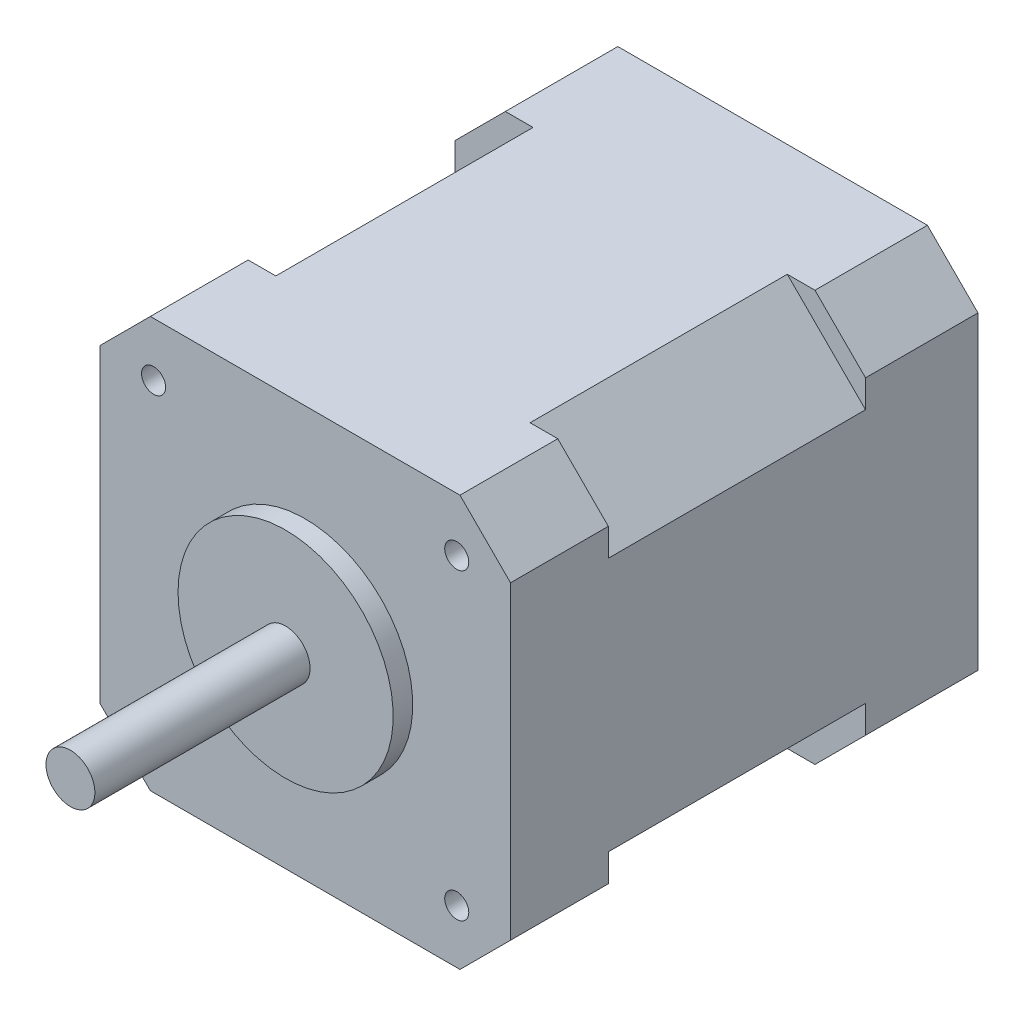
ISO-10303-21;
HEADER;
FILE_DESCRIPTION(('STEP AP214'),'2;1');
FILE_NAME('part.step','',(''),(''),'','','');
FILE_SCHEMA(('AUTOMOTIVE_DESIGN { 1 0 10303 214 1 1 1 1 }'));
ENDSEC;
DATA;
#1=APPLICATION_CONTEXT('core data for automotive mechanical design processes');
#2=APPLICATION_PROTOCOL_DEFINITION('international standard','automotive_design',2000,#1);
#3=PRODUCT_CONTEXT('',#1,'mechanical');
#4=PRODUCT('Part','Part','',(#3));
#5=PRODUCT_RELATED_PRODUCT_CATEGORY('part','',(#4));
#6=PRODUCT_DEFINITION_FORMATION('','',#4);
#7=PRODUCT_DEFINITION_CONTEXT('part definition',#1,'design');
#8=PRODUCT_DEFINITION('design','',#6,#7);
#9=PRODUCT_DEFINITION_SHAPE('','',#8);
#10=(LENGTH_UNIT() NAMED_UNIT(*) SI_UNIT(.MILLI.,.METRE.));
#11=(NAMED_UNIT(*) PLANE_ANGLE_UNIT() SI_UNIT($,.RADIAN.));
#12=(NAMED_UNIT(*) SI_UNIT($,.STERADIAN.) SOLID_ANGLE_UNIT());
#13=UNCERTAINTY_MEASURE_WITH_UNIT(LENGTH_MEASURE(1.E-05),#10,'distance_accuracy_value','');
#14=(GEOMETRIC_REPRESENTATION_CONTEXT(3) GLOBAL_UNCERTAINTY_ASSIGNED_CONTEXT((#13)) GLOBAL_UNIT_ASSIGNED_CONTEXT((#10,
#11,#12)) REPRESENTATION_CONTEXT('',''));
#15=CARTESIAN_POINT('',(0.,0.,0.));
#16=DIRECTION('',(0.,0.,1.));
#17=DIRECTION('',(1.,0.,0.));
#18=AXIS2_PLACEMENT_3D('',#15,#16,#17);
#19=CARTESIAN_POINT('',(21.,21.,11.5));
#20=DIRECTION('',(0.,0.,-1.));
#21=DIRECTION('',(-1.,0.,0.));
#22=AXIS2_PLACEMENT_3D('',#19,#20,#21);
#23=PLANE('',#22);
#24=DIRECTION('',(0.707106781186548,0.707106781186547,0.));
#25=VECTOR('',#24,1.);
#26=CARTESIAN_POINT('',(21.,-13.,11.5));
#27=LINE('',#26,#25);
#28=CARTESIAN_POINT('',(13.,-21.,11.5));
#29=VERTEX_POINT('',#28);
#30=CARTESIAN_POINT('',(21.,-13.,11.5));
#31=VERTEX_POINT('',#30);
#32=EDGE_CURVE('E217',#29,#31,#27,.T.);
#33=ORIENTED_EDGE('',*,*,#32,.F.);
#34=DIRECTION('',(-1.,0.,0.));
#35=VECTOR('',#34,1.);
#36=CARTESIAN_POINT('',(15.8284271247401,-21.,11.5));
#37=LINE('',#36,#35);
#38=CARTESIAN_POINT('',(15.8284271247401,-21.,11.5));
#39=VERTEX_POINT('',#38);
#40=EDGE_CURVE('E487',#39,#29,#37,.T.);
#41=ORIENTED_EDGE('',*,*,#40,.F.);
#42=DIRECTION('',(-0.707106781186547,-0.707106781186547,0.));
#43=VECTOR('',#42,1.);
#44=CARTESIAN_POINT('',(21.,-15.8284271247401,11.5));
#45=LINE('',#44,#43);
#46=CARTESIAN_POINT('',(21.,-15.8284271247401,11.5));
#47=VERTEX_POINT('',#46);
#48=EDGE_CURVE('E474',#47,#39,#45,.T.);
#49=ORIENTED_EDGE('',*,*,#48,.F.);
#50=DIRECTION('',(0.,-1.,0.));
#51=VECTOR('',#50,1.);
#52=CARTESIAN_POINT('',(21.,15.8284271247401,11.5));
#53=LINE('',#52,#51);
#54=EDGE_CURVE('E45',#31,#47,#53,.T.);
#55=ORIENTED_EDGE('',*,*,#54,.F.);
#56=EDGE_LOOP('',(#33,#41,#49,#55));
#57=FACE_BOUND('',#56,.T.);
#58=ADVANCED_FACE('F30',(#57),#23,.F.);
#59=DIRECTION('',(0.707106781186547,-0.707106781186548,0.));
#60=VECTOR('',#59,1.);
#61=CARTESIAN_POINT('',(-13.,-21.,11.5));
#62=LINE('',#61,#60);
#63=CARTESIAN_POINT('',(-21.,-13.,11.5));
#64=VERTEX_POINT('',#63);
#65=CARTESIAN_POINT('',(-13.,-21.,11.5));
#66=VERTEX_POINT('',#65);
#67=EDGE_CURVE('E341',#64,#66,#62,.T.);
#68=ORIENTED_EDGE('',*,*,#67,.F.);
#69=DIRECTION('',(0.,1.,0.));
#70=VECTOR('',#69,1.);
#71=CARTESIAN_POINT('',(-21.,-15.8284271247401,11.5));
#72=LINE('',#71,#70);
#73=CARTESIAN_POINT('',(-21.,-15.8284271247401,11.5));
#74=VERTEX_POINT('',#73);
#75=EDGE_CURVE('E401',#74,#64,#72,.T.);
#76=ORIENTED_EDGE('',*,*,#75,.F.);
#77=DIRECTION('',(-0.707106781186547,0.707106781186548,0.));
#78=VECTOR('',#77,1.);
#79=CARTESIAN_POINT('',(-15.8284271247401,-21.,11.5));
#80=LINE('',#79,#78);
#81=CARTESIAN_POINT('',(-15.8284271247401,-21.,11.5));
#82=VERTEX_POINT('',#81);
#83=EDGE_CURVE('E412',#82,#74,#80,.T.);
#84=ORIENTED_EDGE('',*,*,#83,.F.);
#85=EDGE_CURVE('E477',#66,#82,#37,.T.);
#86=ORIENTED_EDGE('',*,*,#85,.F.);
#87=EDGE_LOOP('',(#68,#76,#84,#86));
#88=FACE_BOUND('',#87,.T.);
#89=ADVANCED_FACE('F494',(#88),#23,.F.);
#90=DIRECTION('',(-0.707106781186548,-0.707106781186548,0.));
#91=VECTOR('',#90,1.);
#92=CARTESIAN_POINT('',(-21.,13.,11.5));
#93=LINE('',#92,#91);
#94=CARTESIAN_POINT('',(-13.,21.,11.5));
#95=VERTEX_POINT('',#94);
#96=CARTESIAN_POINT('',(-21.,13.,11.5));
#97=VERTEX_POINT('',#96);
#98=EDGE_CURVE('E346',#95,#97,#93,.T.);
#99=ORIENTED_EDGE('',*,*,#98,.F.);
#100=DIRECTION('',(1.,0.,0.));
#101=VECTOR('',#100,1.);
#102=CARTESIAN_POINT('',(-15.8284271247401,21.,11.5));
#103=LINE('',#102,#101);
#104=CARTESIAN_POINT('',(-15.8284271247401,21.,11.5));
#105=VERTEX_POINT('',#104);
#106=EDGE_CURVE('E462',#105,#95,#103,.T.);
#107=ORIENTED_EDGE('',*,*,#106,.F.);
#108=DIRECTION('',(0.707106781186547,0.707106781186548,0.));
#109=VECTOR('',#108,1.);
#110=CARTESIAN_POINT('',(-21.,15.8284271247401,11.5));
#111=LINE('',#110,#109);
#112=CARTESIAN_POINT('',(-21.,15.8284271247401,11.5));
#113=VERTEX_POINT('',#112);
#114=EDGE_CURVE('E406',#113,#105,#111,.T.);
#115=ORIENTED_EDGE('',*,*,#114,.F.);
#116=EDGE_CURVE('E407',#97,#113,#72,.T.);
#117=ORIENTED_EDGE('',*,*,#116,.F.);
#118=EDGE_LOOP('',(#99,#107,#115,#117));
#119=FACE_BOUND('',#118,.T.);
#120=ADVANCED_FACE('F496',(#119),#23,.F.);
#121=DIRECTION('',(-0.707106781186548,0.707106781186547,0.));
#122=VECTOR('',#121,1.);
#123=CARTESIAN_POINT('',(13.,21.,11.5));
#124=LINE('',#123,#122);
#125=CARTESIAN_POINT('',(21.,13.,11.5));
#126=VERTEX_POINT('',#125);
#127=CARTESIAN_POINT('',(13.,21.,11.5));
#128=VERTEX_POINT('',#127);
#129=EDGE_CURVE('E53',#126,#128,#124,.T.);
#130=ORIENTED_EDGE('',*,*,#129,.F.);
#131=CARTESIAN_POINT('',(21.,15.8284271247401,11.5));
#132=VERTEX_POINT('',#131);
#133=EDGE_CURVE('E473',#132,#126,#53,.T.);
#134=ORIENTED_EDGE('',*,*,#133,.F.);
#135=DIRECTION('',(0.707106781186547,-0.707106781186548,0.));
#136=VECTOR('',#135,1.);
#137=CARTESIAN_POINT('',(15.8284271247401,21.,11.5));
#138=LINE('',#137,#136);
#139=CARTESIAN_POINT('',(15.8284271247401,21.,11.5));
#140=VERTEX_POINT('',#139);
#141=EDGE_CURVE('E464',#140,#132,#138,.T.);
#142=ORIENTED_EDGE('',*,*,#141,.F.);
#143=EDGE_CURVE('E416',#128,#140,#103,.T.);
#144=ORIENTED_EDGE('',*,*,#143,.F.);
#145=EDGE_LOOP('',(#130,#134,#142,#144));
#146=FACE_BOUND('',#145,.T.);
#147=ADVANCED_FACE('F472',(#146),#23,.F.);
#148=CARTESIAN_POINT('',(-15.8284271247401,21.,11.5));
#149=DIRECTION('',(0.,1.,0.));
#150=DIRECTION('',(0.,0.,1.));
#151=AXIS2_PLACEMENT_3D('',#148,#149,#150);
#152=PLANE('',#151);
#153=DIRECTION('',(1.,0.,0.));
#154=VECTOR('',#153,1.);
#155=CARTESIAN_POINT('',(-15.8284271247401,21.,0.));
#156=LINE('',#155,#154);
#157=CARTESIAN_POINT('',(-15.8284271247401,21.,0.));
#158=VERTEX_POINT('',#157);
#159=CARTESIAN_POINT('',(15.8284271247401,21.,0.));
#160=VERTEX_POINT('',#159);
#161=EDGE_CURVE('E424',#158,#160,#156,.T.);
#162=ORIENTED_EDGE('',*,*,#161,.F.);
#163=DIRECTION('',(0.,0.,-1.));
#164=VECTOR('',#163,1.);
#165=CARTESIAN_POINT('',(-15.8284271247401,21.,11.5));
#166=LINE('',#165,#164);
#167=EDGE_CURVE('E449',#105,#158,#166,.T.);
#168=ORIENTED_EDGE('',*,*,#167,.F.);
#169=ORIENTED_EDGE('',*,*,#106,.T.);
#170=DIRECTION('',(0.,0.,-1.));
#171=VECTOR('',#170,1.);
#172=CARTESIAN_POINT('',(-13.,21.,37.8));
#173=LINE('',#172,#171);
#174=CARTESIAN_POINT('',(-13.,21.,37.8));
#175=VERTEX_POINT('',#174);
#176=EDGE_CURVE('E366',#175,#95,#173,.T.);
#177=ORIENTED_EDGE('',*,*,#176,.F.);
#178=DIRECTION('',(-1.,0.,0.));
#179=VECTOR('',#178,1.);
#180=CARTESIAN_POINT('',(-15.8284271247401,21.,37.8));
#181=LINE('',#180,#179);
#182=CARTESIAN_POINT('',(-15.8284271247401,21.,37.8));
#183=VERTEX_POINT('',#182);
#184=EDGE_CURVE('E215',#175,#183,#181,.T.);
#185=ORIENTED_EDGE('',*,*,#184,.T.);
#186=DIRECTION('',(0.,0.,-1.));
#187=VECTOR('',#186,1.);
#188=CARTESIAN_POINT('',(-15.8284271247401,21.,47.8));
#189=LINE('',#188,#187);
#190=CARTESIAN_POINT('',(-15.8284271247401,21.,47.8));
#191=VERTEX_POINT('',#190);
#192=EDGE_CURVE('E196',#191,#183,#189,.T.);
#193=ORIENTED_EDGE('',*,*,#192,.F.);
#194=DIRECTION('',(-1.,0.,0.));
#195=VECTOR('',#194,1.);
#196=CARTESIAN_POINT('',(-15.8284271247401,21.,47.8));
#197=LINE('',#196,#195);
#198=CARTESIAN_POINT('',(15.8284271247401,21.,47.8));
#199=VERTEX_POINT('',#198);
#200=EDGE_CURVE('E202',#199,#191,#197,.T.);
#201=ORIENTED_EDGE('',*,*,#200,.F.);
#202=DIRECTION('',(0.,0.,-1.));
#203=VECTOR('',#202,1.);
#204=CARTESIAN_POINT('',(15.8284271247401,21.,47.8));
#205=LINE('',#204,#203);
#206=CARTESIAN_POINT('',(15.8284271247401,21.,37.8));
#207=VERTEX_POINT('',#206);
#208=EDGE_CURVE('E284',#199,#207,#205,.T.);
#209=ORIENTED_EDGE('',*,*,#208,.T.);
#210=CARTESIAN_POINT('',(13.,21.,37.8));
#211=VERTEX_POINT('',#210);
#212=EDGE_CURVE('E225',#207,#211,#181,.T.);
#213=ORIENTED_EDGE('',*,*,#212,.T.);
#214=DIRECTION('',(0.,0.,-1.));
#215=VECTOR('',#214,1.);
#216=CARTESIAN_POINT('',(13.,21.,37.8));
#217=LINE('',#216,#215);
#218=EDGE_CURVE('E290',#211,#128,#217,.T.);
#219=ORIENTED_EDGE('',*,*,#218,.T.);
#220=ORIENTED_EDGE('',*,*,#143,.T.);
#221=DIRECTION('',(0.,0.,-1.));
#222=VECTOR('',#221,1.);
#223=CARTESIAN_POINT('',(15.8284271247401,21.,11.5));
#224=LINE('',#223,#222);
#225=EDGE_CURVE('E410',#140,#160,#224,.T.);
#226=ORIENTED_EDGE('',*,*,#225,.T.);
#227=EDGE_LOOP('',(#162,#168,#169,#177,#185,#193,#201,#209,#213,#219,#220,#226));
#228=FACE_BOUND('',#227,.T.);
#229=ADVANCED_FACE('F32',(#228),#152,.T.);
#230=CARTESIAN_POINT('',(-21.,15.8284271247401,11.5));
#231=DIRECTION('',(-0.707106781186548,0.707106781186547,0.));
#232=DIRECTION('',(-0.707106781186547,-0.707106781186548,0.));
#233=AXIS2_PLACEMENT_3D('',#230,#231,#232);
#234=PLANE('',#233);
#235=DIRECTION('',(0.707106781186547,0.707106781186548,0.));
#236=VECTOR('',#235,1.);
#237=CARTESIAN_POINT('',(-21.,15.8284271247401,0.));
#238=LINE('',#237,#236);
#239=CARTESIAN_POINT('',(-21.,15.8284271247401,0.));
#240=VERTEX_POINT('',#239);
#241=EDGE_CURVE('E446',#240,#158,#238,.T.);
#242=ORIENTED_EDGE('',*,*,#241,.F.);
#243=DIRECTION('',(0.,0.,-1.));
#244=VECTOR('',#243,1.);
#245=CARTESIAN_POINT('',(-21.,15.8284271247401,11.5));
#246=LINE('',#245,#244);
#247=EDGE_CURVE('E451',#113,#240,#246,.T.);
#248=ORIENTED_EDGE('',*,*,#247,.F.);
#249=ORIENTED_EDGE('',*,*,#114,.T.);
#250=ORIENTED_EDGE('',*,*,#167,.T.);
#251=EDGE_LOOP('',(#242,#248,#249,#250));
#252=FACE_BOUND('',#251,.T.);
#253=ADVANCED_FACE('F511',(#252),#234,.T.);
#254=CARTESIAN_POINT('',(-21.,-15.8284271247401,11.5));
#255=DIRECTION('',(-1.,0.,0.));
#256=DIRECTION('',(0.,-1.,0.));
#257=AXIS2_PLACEMENT_3D('',#254,#255,#256);
#258=PLANE('',#257);
#259=CARTESIAN_POINT('',(-21.,0.649999999999998,4.95));
#260=DIRECTION('',(-1.,0.,0.));
#261=DIRECTION('',(0.,-1.,0.));
#262=AXIS2_PLACEMENT_3D('',#259,#260,#261);
#263=CIRCLE('',#262,0.6);
#264=CARTESIAN_POINT('',(-21.,0.049999999999998,4.95));
#265=VERTEX_POINT('',#264);
#266=EDGE_CURVE('E11',#265,#265,#263,.T.);
#267=ORIENTED_EDGE('',*,*,#266,.F.);
#268=EDGE_LOOP('',(#267));
#269=FACE_BOUND('',#268,.T.);
#270=CARTESIAN_POINT('',(-21.,-0.650000000000001,4.95));
#271=DIRECTION('',(-1.,0.,0.));
#272=DIRECTION('',(0.,-1.,0.));
#273=AXIS2_PLACEMENT_3D('',#270,#271,#272);
#274=CIRCLE('',#273,0.6);
#275=CARTESIAN_POINT('',(-21.,-1.25,4.95));
#276=VERTEX_POINT('',#275);
#277=EDGE_CURVE('E38',#276,#276,#274,.T.);
#278=ORIENTED_EDGE('',*,*,#277,.F.);
#279=EDGE_LOOP('',(#278));
#280=FACE_BOUND('',#279,.T.);
#281=CARTESIAN_POINT('',(-21.,-0.650000000000001,3.65));
#282=DIRECTION('',(-1.,0.,0.));
#283=DIRECTION('',(0.,-1.,0.));
#284=AXIS2_PLACEMENT_3D('',#281,#282,#283);
#285=CIRCLE('',#284,0.6);
#286=CARTESIAN_POINT('',(-21.,-1.25,3.65));
#287=VERTEX_POINT('',#286);
#288=EDGE_CURVE('E1010',#287,#287,#285,.T.);
#289=ORIENTED_EDGE('',*,*,#288,.F.);
#290=EDGE_LOOP('',(#289));
#291=FACE_BOUND('',#290,.T.);
#292=CARTESIAN_POINT('',(-21.,0.649999999999998,3.65));
#293=DIRECTION('',(-1.,0.,0.));
#294=DIRECTION('',(0.,-1.,0.));
#295=AXIS2_PLACEMENT_3D('',#292,#293,#294);
#296=CIRCLE('',#295,0.6);
#297=CARTESIAN_POINT('',(-21.,0.049999999999998,3.65));
#298=VERTEX_POINT('',#297);
#299=EDGE_CURVE('E351',#298,#298,#296,.T.);
#300=ORIENTED_EDGE('',*,*,#299,.F.);
#301=EDGE_LOOP('',(#300));
#302=FACE_BOUND('',#301,.T.);
#303=DIRECTION('',(0.,1.,0.));
#304=VECTOR('',#303,1.);
#305=CARTESIAN_POINT('',(-21.,-15.8284271247401,0.));
#306=LINE('',#305,#304);
#307=CARTESIAN_POINT('',(-21.,-15.8284271247401,0.));
#308=VERTEX_POINT('',#307);
#309=EDGE_CURVE('E443',#308,#240,#306,.T.);
#310=ORIENTED_EDGE('',*,*,#309,.F.);
#311=DIRECTION('',(0.,0.,-1.));
#312=VECTOR('',#311,1.);
#313=CARTESIAN_POINT('',(-21.,-15.8284271247401,11.5));
#314=LINE('',#313,#312);
#315=EDGE_CURVE('E402',#74,#308,#314,.T.);
#316=ORIENTED_EDGE('',*,*,#315,.F.);
#317=ORIENTED_EDGE('',*,*,#75,.T.);
#318=DIRECTION('',(0.,0.,-1.));
#319=VECTOR('',#318,1.);
#320=CARTESIAN_POINT('',(-21.,-13.,37.8));
#321=LINE('',#320,#319);
#322=CARTESIAN_POINT('',(-21.,-13.,37.8));
#323=VERTEX_POINT('',#322);
#324=EDGE_CURVE('E374',#323,#64,#321,.T.);
#325=ORIENTED_EDGE('',*,*,#324,.F.);
#326=DIRECTION('',(0.,-1.,0.));
#327=VECTOR('',#326,1.);
#328=CARTESIAN_POINT('',(-21.,-15.8284271247401,37.8));
#329=LINE('',#328,#327);
#330=CARTESIAN_POINT('',(-21.,-15.8284271247401,37.8));
#331=VERTEX_POINT('',#330);
#332=EDGE_CURVE('E237',#323,#331,#329,.T.);
#333=ORIENTED_EDGE('',*,*,#332,.T.);
#334=DIRECTION('',(0.,0.,-1.));
#335=VECTOR('',#334,1.);
#336=CARTESIAN_POINT('',(-21.,-15.8284271247401,47.8));
#337=LINE('',#336,#335);
#338=CARTESIAN_POINT('',(-21.,-15.8284271247401,47.8));
#339=VERTEX_POINT('',#338);
#340=EDGE_CURVE('E221',#339,#331,#337,.T.);
#341=ORIENTED_EDGE('',*,*,#340,.F.);
#342=DIRECTION('',(0.,-1.,0.));
#343=VECTOR('',#342,1.);
#344=CARTESIAN_POINT('',(-21.,-15.8284271247401,47.8));
#345=LINE('',#344,#343);
#346=CARTESIAN_POINT('',(-21.,15.8284271247401,47.8));
#347=VERTEX_POINT('',#346);
#348=EDGE_CURVE('E201',#347,#339,#345,.T.);
#349=ORIENTED_EDGE('',*,*,#348,.F.);
#350=DIRECTION('',(0.,0.,-1.));
#351=VECTOR('',#350,1.);
#352=CARTESIAN_POINT('',(-21.,15.8284271247401,47.8));
#353=LINE('',#352,#351);
#354=CARTESIAN_POINT('',(-21.,15.8284271247401,37.8));
#355=VERTEX_POINT('',#354);
#356=EDGE_CURVE('E198',#347,#355,#353,.T.);
#357=ORIENTED_EDGE('',*,*,#356,.T.);
#358=CARTESIAN_POINT('',(-21.,13.,37.8));
#359=VERTEX_POINT('',#358);
#360=EDGE_CURVE('E246',#355,#359,#329,.T.);
#361=ORIENTED_EDGE('',*,*,#360,.T.);
#362=DIRECTION('',(0.,0.,-1.));
#363=VECTOR('',#362,1.);
#364=CARTESIAN_POINT('',(-21.,13.,37.8));
#365=LINE('',#364,#363);
#366=EDGE_CURVE('E369',#359,#97,#365,.T.);
#367=ORIENTED_EDGE('',*,*,#366,.T.);
#368=ORIENTED_EDGE('',*,*,#116,.T.);
#369=ORIENTED_EDGE('',*,*,#247,.T.);
#370=EDGE_LOOP('',(#310,#316,#317,#325,#333,#341,#349,#357,#361,#367,#368,#369));
#371=FACE_BOUND('',#370,.T.);
#372=ADVANCED_FACE('F399',(#269,#280,#291,#302,#371),#258,.T.);
#373=CARTESIAN_POINT('',(-15.8284271247401,-21.,11.5));
#374=DIRECTION('',(-0.707106781186548,-0.707106781186547,0.));
#375=DIRECTION('',(0.707106781186547,-0.707106781186548,0.));
#376=AXIS2_PLACEMENT_3D('',#373,#374,#375);
#377=PLANE('',#376);
#378=DIRECTION('',(-0.707106781186547,0.707106781186548,0.));
#379=VECTOR('',#378,1.);
#380=CARTESIAN_POINT('',(-15.8284271247401,-21.,0.));
#381=LINE('',#380,#379);
#382=CARTESIAN_POINT('',(-15.8284271247401,-21.,0.));
#383=VERTEX_POINT('',#382);
#384=EDGE_CURVE('E440',#383,#308,#381,.T.);
#385=ORIENTED_EDGE('',*,*,#384,.F.);
#386=DIRECTION('',(0.,0.,-1.));
#387=VECTOR('',#386,1.);
#388=CARTESIAN_POINT('',(-15.8284271247401,-21.,11.5));
#389=LINE('',#388,#387);
#390=EDGE_CURVE('E454',#82,#383,#389,.T.);
#391=ORIENTED_EDGE('',*,*,#390,.F.);
#392=ORIENTED_EDGE('',*,*,#83,.T.);
#393=ORIENTED_EDGE('',*,*,#315,.T.);
#394=EDGE_LOOP('',(#385,#391,#392,#393));
#395=FACE_BOUND('',#394,.T.);
#396=ADVANCED_FACE('F493',(#395),#377,.T.);
#397=CARTESIAN_POINT('',(15.8284271247401,-21.,11.5));
#398=DIRECTION('',(0.,-1.,0.));
#399=DIRECTION('',(1.,0.,0.));
#400=AXIS2_PLACEMENT_3D('',#397,#398,#399);
#401=PLANE('',#400);
#402=DIRECTION('',(-1.,0.,0.));
#403=VECTOR('',#402,1.);
#404=CARTESIAN_POINT('',(15.8284271247401,-21.,0.));
#405=LINE('',#404,#403);
#406=CARTESIAN_POINT('',(15.8284271247401,-21.,0.));
#407=VERTEX_POINT('',#406);
#408=EDGE_CURVE('E437',#407,#383,#405,.T.);
#409=ORIENTED_EDGE('',*,*,#408,.F.);
#410=DIRECTION('',(0.,0.,-1.));
#411=VECTOR('',#410,1.);
#412=CARTESIAN_POINT('',(15.8284271247401,-21.,11.5));
#413=LINE('',#412,#411);
#414=EDGE_CURVE('E456',#39,#407,#413,.T.);
#415=ORIENTED_EDGE('',*,*,#414,.F.);
#416=ORIENTED_EDGE('',*,*,#40,.T.);
#417=DIRECTION('',(0.,0.,-1.));
#418=VECTOR('',#417,1.);
#419=CARTESIAN_POINT('',(13.,-21.,37.8));
#420=LINE('',#419,#418);
#421=CARTESIAN_POINT('',(13.,-21.,37.8));
#422=VERTEX_POINT('',#421);
#423=EDGE_CURVE('E363',#422,#29,#420,.T.);
#424=ORIENTED_EDGE('',*,*,#423,.F.);
#425=DIRECTION('',(1.,0.,0.));
#426=VECTOR('',#425,1.);
#427=CARTESIAN_POINT('',(15.8284271247401,-21.,37.8));
#428=LINE('',#427,#426);
#429=CARTESIAN_POINT('',(15.8284271247401,-21.,37.8));
#430=VERTEX_POINT('',#429);
#431=EDGE_CURVE('E249',#422,#430,#428,.T.);
#432=ORIENTED_EDGE('',*,*,#431,.T.);
#433=DIRECTION('',(0.,0.,-1.));
#434=VECTOR('',#433,1.);
#435=CARTESIAN_POINT('',(15.8284271247401,-21.,47.8));
#436=LINE('',#435,#434);
#437=CARTESIAN_POINT('',(15.8284271247401,-21.,47.8));
#438=VERTEX_POINT('',#437);
#439=EDGE_CURVE('E294',#438,#430,#436,.T.);
#440=ORIENTED_EDGE('',*,*,#439,.F.);
#441=DIRECTION('',(1.,0.,0.));
#442=VECTOR('',#441,1.);
#443=CARTESIAN_POINT('',(15.8284271247401,-21.,47.8));
#444=LINE('',#443,#442);
#445=CARTESIAN_POINT('',(-15.8284271247401,-21.,47.8));
#446=VERTEX_POINT('',#445);
#447=EDGE_CURVE('E323',#446,#438,#444,.T.);
#448=ORIENTED_EDGE('',*,*,#447,.F.);
#449=DIRECTION('',(0.,0.,-1.));
#450=VECTOR('',#449,1.);
#451=CARTESIAN_POINT('',(-15.8284271247401,-21.,47.8));
#452=LINE('',#451,#450);
#453=CARTESIAN_POINT('',(-15.8284271247401,-21.,37.8));
#454=VERTEX_POINT('',#453);
#455=EDGE_CURVE('E297',#446,#454,#452,.T.);
#456=ORIENTED_EDGE('',*,*,#455,.T.);
#457=CARTESIAN_POINT('',(-13.,-21.,37.8));
#458=VERTEX_POINT('',#457);
#459=EDGE_CURVE('E251',#454,#458,#428,.T.);
#460=ORIENTED_EDGE('',*,*,#459,.T.);
#461=DIRECTION('',(0.,0.,-1.));
#462=VECTOR('',#461,1.);
#463=CARTESIAN_POINT('',(-13.,-21.,37.8));
#464=LINE('',#463,#462);
#465=EDGE_CURVE('E320',#458,#66,#464,.T.);
#466=ORIENTED_EDGE('',*,*,#465,.T.);
#467=ORIENTED_EDGE('',*,*,#85,.T.);
#468=ORIENTED_EDGE('',*,*,#390,.T.);
#469=EDGE_LOOP('',(#409,#415,#416,#424,#432,#440,#448,#456,#460,#466,#467,#468));
#470=FACE_BOUND('',#469,.T.);
#471=ADVANCED_FACE('F319',(#470),#401,.T.);
#472=CARTESIAN_POINT('',(21.,-15.8284271247401,11.5));
#473=DIRECTION('',(0.707106781186548,-0.707106781186548,0.));
#474=DIRECTION('',(0.707106781186548,0.707106781186548,0.));
#475=AXIS2_PLACEMENT_3D('',#472,#473,#474);
#476=PLANE('',#475);
#477=DIRECTION('',(-0.707106781186547,-0.707106781186547,0.));
#478=VECTOR('',#477,1.);
#479=CARTESIAN_POINT('',(21.,-15.8284271247401,0.));
#480=LINE('',#479,#478);
#481=CARTESIAN_POINT('',(21.,-15.8284271247401,0.));
#482=VERTEX_POINT('',#481);
#483=EDGE_CURVE('E434',#482,#407,#480,.T.);
#484=ORIENTED_EDGE('',*,*,#483,.F.);
#485=DIRECTION('',(0.,0.,-1.));
#486=VECTOR('',#485,1.);
#487=CARTESIAN_POINT('',(21.,-15.8284271247401,11.5));
#488=LINE('',#487,#486);
#489=EDGE_CURVE('E458',#47,#482,#488,.T.);
#490=ORIENTED_EDGE('',*,*,#489,.F.);
#491=ORIENTED_EDGE('',*,*,#48,.T.);
#492=ORIENTED_EDGE('',*,*,#414,.T.);
#493=EDGE_LOOP('',(#484,#490,#491,#492));
#494=FACE_BOUND('',#493,.T.);
#495=ADVANCED_FACE('F522',(#494),#476,.T.);
#496=CARTESIAN_POINT('',(21.,15.8284271247401,11.5));
#497=DIRECTION('',(1.,0.,0.));
#498=DIRECTION('',(0.,0.,-1.));
#499=AXIS2_PLACEMENT_3D('',#496,#497,#498);
#500=PLANE('',#499);
#501=DIRECTION('',(0.,-1.,0.));
#502=VECTOR('',#501,1.);
#503=CARTESIAN_POINT('',(21.,15.8284271247401,0.));
#504=LINE('',#503,#502);
#505=CARTESIAN_POINT('',(21.,15.8284271247401,0.));
#506=VERTEX_POINT('',#505);
#507=EDGE_CURVE('E431',#506,#482,#504,.T.);
#508=ORIENTED_EDGE('',*,*,#507,.F.);
#509=DIRECTION('',(0.,0.,-1.));
#510=VECTOR('',#509,1.);
#511=CARTESIAN_POINT('',(21.,15.8284271247401,11.5));
#512=LINE('',#511,#510);
#513=EDGE_CURVE('E460',#132,#506,#512,.T.);
#514=ORIENTED_EDGE('',*,*,#513,.F.);
#515=ORIENTED_EDGE('',*,*,#133,.T.);
#516=DIRECTION('',(0.,0.,-1.));
#517=VECTOR('',#516,1.);
#518=CARTESIAN_POINT('',(21.,13.,37.8));
#519=LINE('',#518,#517);
#520=CARTESIAN_POINT('',(21.,13.,37.8));
#521=VERTEX_POINT('',#520);
#522=EDGE_CURVE('E276',#521,#126,#519,.T.);
#523=ORIENTED_EDGE('',*,*,#522,.F.);
#524=DIRECTION('',(0.,1.,0.));
#525=VECTOR('',#524,1.);
#526=CARTESIAN_POINT('',(21.,15.8284271247401,37.8));
#527=LINE('',#526,#525);
#528=CARTESIAN_POINT('',(21.,15.8284271247401,37.8));
#529=VERTEX_POINT('',#528);
#530=EDGE_CURVE('E258',#521,#529,#527,.T.);
#531=ORIENTED_EDGE('',*,*,#530,.T.);
#532=DIRECTION('',(0.,0.,-1.));
#533=VECTOR('',#532,1.);
#534=CARTESIAN_POINT('',(21.,15.8284271247401,47.8));
#535=LINE('',#534,#533);
#536=CARTESIAN_POINT('',(21.,15.8284271247401,47.8));
#537=VERTEX_POINT('',#536);
#538=EDGE_CURVE('E274',#537,#529,#535,.T.);
#539=ORIENTED_EDGE('',*,*,#538,.F.);
#540=DIRECTION('',(0.,1.,0.));
#541=VECTOR('',#540,1.);
#542=CARTESIAN_POINT('',(21.,15.8284271247401,47.8));
#543=LINE('',#542,#541);
#544=CARTESIAN_POINT('',(21.,-15.8284271247401,47.8));
#545=VERTEX_POINT('',#544);
#546=EDGE_CURVE('E291',#545,#537,#543,.T.);
#547=ORIENTED_EDGE('',*,*,#546,.F.);
#548=DIRECTION('',(0.,0.,-1.));
#549=VECTOR('',#548,1.);
#550=CARTESIAN_POINT('',(21.,-15.8284271247401,47.8));
#551=LINE('',#550,#549);
#552=CARTESIAN_POINT('',(21.,-15.8284271247401,37.8));
#553=VERTEX_POINT('',#552);
#554=EDGE_CURVE('E283',#545,#553,#551,.T.);
#555=ORIENTED_EDGE('',*,*,#554,.T.);
#556=CARTESIAN_POINT('',(21.,-13.,37.8));
#557=VERTEX_POINT('',#556);
#558=EDGE_CURVE('E263',#553,#557,#527,.T.);
#559=ORIENTED_EDGE('',*,*,#558,.T.);
#560=DIRECTION('',(0.,0.,-1.));
#561=VECTOR('',#560,1.);
#562=CARTESIAN_POINT('',(21.,-13.,37.8));
#563=LINE('',#562,#561);
#564=EDGE_CURVE('E428',#557,#31,#563,.T.);
#565=ORIENTED_EDGE('',*,*,#564,.T.);
#566=ORIENTED_EDGE('',*,*,#54,.T.);
#567=ORIENTED_EDGE('',*,*,#489,.T.);
#568=EDGE_LOOP('',(#508,#514,#515,#523,#531,#539,#547,#555,#559,#565,#566,#567));
#569=FACE_BOUND('',#568,.T.);
#570=ADVANCED_FACE('F272',(#569),#500,.T.);
#571=CARTESIAN_POINT('',(15.8284271247401,21.,11.5));
#572=DIRECTION('',(0.707106781186548,0.707106781186547,0.));
#573=DIRECTION('',(-0.707106781186547,0.707106781186548,0.));
#574=AXIS2_PLACEMENT_3D('',#571,#572,#573);
#575=PLANE('',#574);
#576=DIRECTION('',(0.707106781186547,-0.707106781186548,0.));
#577=VECTOR('',#576,1.);
#578=CARTESIAN_POINT('',(15.8284271247401,21.,0.));
#579=LINE('',#578,#577);
#580=EDGE_CURVE('E427',#160,#506,#579,.T.);
#581=ORIENTED_EDGE('',*,*,#580,.F.);
#582=ORIENTED_EDGE('',*,*,#225,.F.);
#583=ORIENTED_EDGE('',*,*,#141,.T.);
#584=ORIENTED_EDGE('',*,*,#513,.T.);
#585=EDGE_LOOP('',(#581,#582,#583,#584));
#586=FACE_BOUND('',#585,.T.);
#587=ADVANCED_FACE('F471',(#586),#575,.T.);
#588=CARTESIAN_POINT('',(21.,21.,0.));
#589=DIRECTION('',(0.,0.,-1.));
#590=DIRECTION('',(-1.,0.,0.));
#591=AXIS2_PLACEMENT_3D('',#588,#589,#590);
#592=PLANE('',#591);
#593=ORIENTED_EDGE('',*,*,#161,.T.);
#594=ORIENTED_EDGE('',*,*,#580,.T.);
#595=ORIENTED_EDGE('',*,*,#507,.T.);
#596=ORIENTED_EDGE('',*,*,#483,.T.);
#597=ORIENTED_EDGE('',*,*,#408,.T.);
#598=ORIENTED_EDGE('',*,*,#384,.T.);
#599=ORIENTED_EDGE('',*,*,#309,.T.);
#600=ORIENTED_EDGE('',*,*,#241,.T.);
#601=EDGE_LOOP('',(#593,#594,#595,#596,#597,#598,#599,#600));
#602=FACE_BOUND('',#601,.T.);
#603=ADVANCED_FACE('F507',(#602),#592,.T.);
#604=CARTESIAN_POINT('',(21.,-13.,37.8));
#605=DIRECTION('',(-0.707106781186547,0.707106781186548,0.));
#606=DIRECTION('',(-0.707106781186548,-0.707106781186547,0.));
#607=AXIS2_PLACEMENT_3D('',#604,#605,#606);
#608=PLANE('',#607);
#609=ORIENTED_EDGE('',*,*,#32,.T.);
#610=ORIENTED_EDGE('',*,*,#564,.F.);
#611=DIRECTION('',(0.707106781186548,0.707106781186547,0.));
#612=VECTOR('',#611,1.);
#613=CARTESIAN_POINT('',(21.,-13.,37.8));
#614=LINE('',#613,#612);
#615=EDGE_CURVE('E338',#422,#557,#614,.T.);
#616=ORIENTED_EDGE('',*,*,#615,.F.);
#617=ORIENTED_EDGE('',*,*,#423,.T.);
#618=EDGE_LOOP('',(#609,#610,#616,#617));
#619=FACE_BOUND('',#618,.T.);
#620=ADVANCED_FACE('F505',(#619),#608,.F.);
#621=CARTESIAN_POINT('',(13.,21.,37.8));
#622=DIRECTION('',(-0.707106781186547,-0.707106781186548,0.));
#623=DIRECTION('',(0.707106781186548,-0.707106781186547,0.));
#624=AXIS2_PLACEMENT_3D('',#621,#622,#623);
#625=PLANE('',#624);
#626=ORIENTED_EDGE('',*,*,#129,.T.);
#627=ORIENTED_EDGE('',*,*,#218,.F.);
#628=DIRECTION('',(-0.707106781186548,0.707106781186547,0.));
#629=VECTOR('',#628,1.);
#630=CARTESIAN_POINT('',(13.,21.,37.8));
#631=LINE('',#630,#629);
#632=EDGE_CURVE('E288',#521,#211,#631,.T.);
#633=ORIENTED_EDGE('',*,*,#632,.F.);
#634=ORIENTED_EDGE('',*,*,#522,.T.);
#635=EDGE_LOOP('',(#626,#627,#633,#634));
#636=FACE_BOUND('',#635,.T.);
#637=ADVANCED_FACE('F544',(#636),#625,.F.);
#638=CARTESIAN_POINT('',(-21.,13.,37.8));
#639=DIRECTION('',(0.707106781186547,-0.707106781186547,0.));
#640=DIRECTION('',(0.707106781186548,0.707106781186548,0.));
#641=AXIS2_PLACEMENT_3D('',#638,#639,#640);
#642=PLANE('',#641);
#643=ORIENTED_EDGE('',*,*,#98,.T.);
#644=ORIENTED_EDGE('',*,*,#366,.F.);
#645=DIRECTION('',(-0.707106781186548,-0.707106781186548,0.));
#646=VECTOR('',#645,1.);
#647=CARTESIAN_POINT('',(-21.,13.,37.8));
#648=LINE('',#647,#646);
#649=EDGE_CURVE('E343',#175,#359,#648,.T.);
#650=ORIENTED_EDGE('',*,*,#649,.F.);
#651=ORIENTED_EDGE('',*,*,#176,.T.);
#652=EDGE_LOOP('',(#643,#644,#650,#651));
#653=FACE_BOUND('',#652,.T.);
#654=ADVANCED_FACE('F550',(#653),#642,.F.);
#655=CARTESIAN_POINT('',(-13.,-21.,37.8));
#656=DIRECTION('',(0.707106781186548,0.707106781186547,0.));
#657=DIRECTION('',(-0.707106781186547,0.707106781186548,0.));
#658=AXIS2_PLACEMENT_3D('',#655,#656,#657);
#659=PLANE('',#658);
#660=ORIENTED_EDGE('',*,*,#67,.T.);
#661=ORIENTED_EDGE('',*,*,#465,.F.);
#662=DIRECTION('',(0.707106781186547,-0.707106781186548,0.));
#663=VECTOR('',#662,1.);
#664=CARTESIAN_POINT('',(-13.,-21.,37.8));
#665=LINE('',#664,#663);
#666=EDGE_CURVE('E315',#323,#458,#665,.T.);
#667=ORIENTED_EDGE('',*,*,#666,.F.);
#668=ORIENTED_EDGE('',*,*,#324,.T.);
#669=EDGE_LOOP('',(#660,#661,#667,#668));
#670=FACE_BOUND('',#669,.T.);
#671=ADVANCED_FACE('F396',(#670),#659,.F.);
#672=CARTESIAN_POINT('',(21.,21.,37.8));
#673=DIRECTION('',(0.,0.,-1.));
#674=DIRECTION('',(-1.,0.,0.));
#675=AXIS2_PLACEMENT_3D('',#672,#673,#674);
#676=PLANE('',#675);
#677=ORIENTED_EDGE('',*,*,#431,.F.);
#678=ORIENTED_EDGE('',*,*,#615,.T.);
#679=ORIENTED_EDGE('',*,*,#558,.F.);
#680=DIRECTION('',(0.707106781186548,0.707106781186547,0.));
#681=VECTOR('',#680,1.);
#682=CARTESIAN_POINT('',(21.,-15.8284271247401,37.8));
#683=LINE('',#682,#681);
#684=EDGE_CURVE('E255',#430,#553,#683,.T.);
#685=ORIENTED_EDGE('',*,*,#684,.F.);
#686=EDGE_LOOP('',(#677,#678,#679,#685));
#687=FACE_BOUND('',#686,.T.);
#688=ADVANCED_FACE('F336',(#687),#676,.T.);
#689=ORIENTED_EDGE('',*,*,#530,.F.);
#690=ORIENTED_EDGE('',*,*,#632,.T.);
#691=ORIENTED_EDGE('',*,*,#212,.F.);
#692=DIRECTION('',(-0.707106781186547,0.707106781186548,0.));
#693=VECTOR('',#692,1.);
#694=CARTESIAN_POINT('',(15.8284271247401,21.,37.8));
#695=LINE('',#694,#693);
#696=EDGE_CURVE('E211',#529,#207,#695,.T.);
#697=ORIENTED_EDGE('',*,*,#696,.F.);
#698=EDGE_LOOP('',(#689,#690,#691,#697));
#699=FACE_BOUND('',#698,.T.);
#700=ADVANCED_FACE('F287',(#699),#676,.T.);
#701=ORIENTED_EDGE('',*,*,#184,.F.);
#702=ORIENTED_EDGE('',*,*,#649,.T.);
#703=ORIENTED_EDGE('',*,*,#360,.F.);
#704=DIRECTION('',(-0.707106781186547,-0.707106781186547,0.));
#705=VECTOR('',#704,1.);
#706=CARTESIAN_POINT('',(-21.,15.8284271247401,37.8));
#707=LINE('',#706,#705);
#708=EDGE_CURVE('E229',#183,#355,#707,.T.);
#709=ORIENTED_EDGE('',*,*,#708,.F.);
#710=EDGE_LOOP('',(#701,#702,#703,#709));
#711=FACE_BOUND('',#710,.T.);
#712=ADVANCED_FACE('F576',(#711),#676,.T.);
#713=CARTESIAN_POINT('',(-21.,15.8284271247401,47.8));
#714=DIRECTION('',(0.707106781186548,-0.707106781186548,0.));
#715=DIRECTION('',(0.707106781186548,0.707106781186548,0.));
#716=AXIS2_PLACEMENT_3D('',#713,#714,#715);
#717=PLANE('',#716);
#718=ORIENTED_EDGE('',*,*,#708,.T.);
#719=ORIENTED_EDGE('',*,*,#356,.F.);
#720=DIRECTION('',(-0.707106781186547,-0.707106781186547,0.));
#721=VECTOR('',#720,1.);
#722=CARTESIAN_POINT('',(-21.,15.8284271247401,47.8));
#723=LINE('',#722,#721);
#724=EDGE_CURVE('E192',#191,#347,#723,.T.);
#725=ORIENTED_EDGE('',*,*,#724,.F.);
#726=ORIENTED_EDGE('',*,*,#192,.T.);
#727=EDGE_LOOP('',(#718,#719,#725,#726));
#728=FACE_BOUND('',#727,.T.);
#729=ADVANCED_FACE('F194',(#728),#717,.F.);
#730=CARTESIAN_POINT('',(-15.8284271247401,-21.,47.8));
#731=DIRECTION('',(0.707106781186548,0.707106781186547,0.));
#732=DIRECTION('',(-0.707106781186547,0.707106781186548,0.));
#733=AXIS2_PLACEMENT_3D('',#730,#731,#732);
#734=PLANE('',#733);
#735=DIRECTION('',(0.707106781186547,-0.707106781186548,0.));
#736=VECTOR('',#735,1.);
#737=CARTESIAN_POINT('',(-15.8284271247401,-21.,37.8));
#738=LINE('',#737,#736);
#739=EDGE_CURVE('E240',#331,#454,#738,.T.);
#740=ORIENTED_EDGE('',*,*,#739,.T.);
#741=ORIENTED_EDGE('',*,*,#455,.F.);
#742=DIRECTION('',(0.707106781186547,-0.707106781186548,0.));
#743=VECTOR('',#742,1.);
#744=CARTESIAN_POINT('',(-15.8284271247401,-21.,47.8));
#745=LINE('',#744,#743);
#746=EDGE_CURVE('E306',#339,#446,#745,.T.);
#747=ORIENTED_EDGE('',*,*,#746,.F.);
#748=ORIENTED_EDGE('',*,*,#340,.T.);
#749=EDGE_LOOP('',(#740,#741,#747,#748));
#750=FACE_BOUND('',#749,.T.);
#751=ADVANCED_FACE('F304',(#750),#734,.F.);
#752=CARTESIAN_POINT('',(21.,-15.8284271247401,47.8));
#753=DIRECTION('',(-0.707106781186547,0.707106781186548,0.));
#754=DIRECTION('',(-0.707106781186548,-0.707106781186547,0.));
#755=AXIS2_PLACEMENT_3D('',#752,#753,#754);
#756=PLANE('',#755);
#757=ORIENTED_EDGE('',*,*,#684,.T.);
#758=ORIENTED_EDGE('',*,*,#554,.F.);
#759=DIRECTION('',(0.707106781186548,0.707106781186547,0.));
#760=VECTOR('',#759,1.);
#761=CARTESIAN_POINT('',(21.,-15.8284271247401,47.8));
#762=LINE('',#761,#760);
#763=EDGE_CURVE('E325',#438,#545,#762,.T.);
#764=ORIENTED_EDGE('',*,*,#763,.F.);
#765=ORIENTED_EDGE('',*,*,#439,.T.);
#766=EDGE_LOOP('',(#757,#758,#764,#765));
#767=FACE_BOUND('',#766,.T.);
#768=ADVANCED_FACE('F594',(#767),#756,.F.);
#769=CARTESIAN_POINT('',(15.8284271247401,21.,47.8));
#770=DIRECTION('',(-0.707106781186548,-0.707106781186547,0.));
#771=DIRECTION('',(0.707106781186547,-0.707106781186548,0.));
#772=AXIS2_PLACEMENT_3D('',#769,#770,#771);
#773=PLANE('',#772);
#774=ORIENTED_EDGE('',*,*,#696,.T.);
#775=ORIENTED_EDGE('',*,*,#208,.F.);
#776=DIRECTION('',(-0.707106781186547,0.707106781186548,0.));
#777=VECTOR('',#776,1.);
#778=CARTESIAN_POINT('',(15.8284271247401,21.,47.8));
#779=LINE('',#778,#777);
#780=EDGE_CURVE('E207',#537,#199,#779,.T.);
#781=ORIENTED_EDGE('',*,*,#780,.F.);
#782=ORIENTED_EDGE('',*,*,#538,.T.);
#783=EDGE_LOOP('',(#774,#775,#781,#782));
#784=FACE_BOUND('',#783,.T.);
#785=ADVANCED_FACE('F282',(#784),#773,.F.);
#786=CARTESIAN_POINT('',(21.,21.,47.8));
#787=DIRECTION('',(0.,0.,-1.));
#788=DIRECTION('',(-1.,0.,0.));
#789=AXIS2_PLACEMENT_3D('',#786,#787,#788);
#790=PLANE('',#789);
#791=CARTESIAN_POINT('',(15.5,-15.5,47.8));
#792=DIRECTION('',(0.,0.,1.));
#793=DIRECTION('',(1.,0.,0.));
#794=AXIS2_PLACEMENT_3D('',#791,#792,#793);
#795=CIRCLE('',#794,1.22950000000001);
#796=CARTESIAN_POINT('',(16.7295,-15.5,47.8));
#797=VERTEX_POINT('',#796);
#798=EDGE_CURVE('E943',#797,#797,#795,.T.);
#799=ORIENTED_EDGE('',*,*,#798,.F.);
#800=EDGE_LOOP('',(#799));
#801=FACE_BOUND('',#800,.T.);
#802=CARTESIAN_POINT('',(15.5,15.5,47.8));
#803=DIRECTION('',(0.,0.,1.));
#804=DIRECTION('',(1.,0.,0.));
#805=AXIS2_PLACEMENT_3D('',#802,#803,#804);
#806=CIRCLE('',#805,1.22950000000001);
#807=CARTESIAN_POINT('',(16.7295,15.5,47.8));
#808=VERTEX_POINT('',#807);
#809=EDGE_CURVE('E945',#808,#808,#806,.T.);
#810=ORIENTED_EDGE('',*,*,#809,.F.);
#811=EDGE_LOOP('',(#810));
#812=FACE_BOUND('',#811,.T.);
#813=CARTESIAN_POINT('',(-15.5,-15.5,47.8));
#814=DIRECTION('',(0.,0.,1.));
#815=DIRECTION('',(1.,0.,0.));
#816=AXIS2_PLACEMENT_3D('',#813,#814,#815);
#817=CIRCLE('',#816,1.22950000000002);
#818=CARTESIAN_POINT('',(-14.2705,-15.5,47.8));
#819=VERTEX_POINT('',#818);
#820=EDGE_CURVE('E953',#819,#819,#817,.T.);
#821=ORIENTED_EDGE('',*,*,#820,.F.);
#822=EDGE_LOOP('',(#821));
#823=FACE_BOUND('',#822,.T.);
#824=CARTESIAN_POINT('',(-15.5,15.5,47.8));
#825=DIRECTION('',(0.,0.,1.));
#826=DIRECTION('',(1.,0.,0.));
#827=AXIS2_PLACEMENT_3D('',#824,#825,#826);
#828=CIRCLE('',#827,1.22950000000001);
#829=CARTESIAN_POINT('',(-14.2705,15.5,47.8));
#830=VERTEX_POINT('',#829);
#831=EDGE_CURVE('E959',#830,#830,#828,.T.);
#832=ORIENTED_EDGE('',*,*,#831,.F.);
#833=EDGE_LOOP('',(#832));
#834=FACE_BOUND('',#833,.T.);
#835=CARTESIAN_POINT('',(0.,0.,47.8));
#836=DIRECTION('',(0.,0.,-1.));
#837=DIRECTION('',(-1.,0.,0.));
#838=AXIS2_PLACEMENT_3D('',#835,#836,#837);
#839=CIRCLE('',#838,11.);
#840=CARTESIAN_POINT('',(-11.,0.,47.8));
#841=VERTEX_POINT('',#840);
#842=EDGE_CURVE('E971',#841,#841,#839,.T.);
#843=ORIENTED_EDGE('',*,*,#842,.T.);
#844=EDGE_LOOP('',(#843));
#845=FACE_BOUND('',#844,.T.);
#846=ORIENTED_EDGE('',*,*,#200,.T.);
#847=ORIENTED_EDGE('',*,*,#724,.T.);
#848=ORIENTED_EDGE('',*,*,#348,.T.);
#849=ORIENTED_EDGE('',*,*,#746,.T.);
#850=ORIENTED_EDGE('',*,*,#447,.T.);
#851=ORIENTED_EDGE('',*,*,#763,.T.);
#852=ORIENTED_EDGE('',*,*,#546,.T.);
#853=ORIENTED_EDGE('',*,*,#780,.T.);
#854=EDGE_LOOP('',(#846,#847,#848,#849,#850,#851,#852,#853));
#855=FACE_BOUND('',#854,.T.);
#856=ADVANCED_FACE('F205',(#801,#812,#823,#834,#845,#855),#790,.F.);
#857=ORIENTED_EDGE('',*,*,#332,.F.);
#858=ORIENTED_EDGE('',*,*,#666,.T.);
#859=ORIENTED_EDGE('',*,*,#459,.F.);
#860=ORIENTED_EDGE('',*,*,#739,.F.);
#861=EDGE_LOOP('',(#857,#858,#859,#860));
#862=FACE_BOUND('',#861,.T.);
#863=ADVANCED_FACE('F311',(#862),#676,.T.);
#864=CARTESIAN_POINT('',(-31.,0.649999999999999,3.65));
#865=DIRECTION('',(1.,0.,0.));
#866=DIRECTION('',(0.,1.,0.));
#867=AXIS2_PLACEMENT_3D('',#864,#865,#866);
#868=CYLINDRICAL_SURFACE('',#867,0.6);
#869=CARTESIAN_POINT('',(-31.,0.649999999999999,3.65));
#870=DIRECTION('',(1.,0.,0.));
#871=DIRECTION('',(0.,1.,0.));
#872=AXIS2_PLACEMENT_3D('',#869,#870,#871);
#873=CIRCLE('',#872,0.6);
#874=CARTESIAN_POINT('',(-31.,1.25,3.65));
#875=VERTEX_POINT('',#874);
#876=EDGE_CURVE('E986',#875,#875,#873,.T.);
#877=ORIENTED_EDGE('',*,*,#876,.T.);
#878=EDGE_LOOP('',(#877));
#879=FACE_BOUND('',#878,.T.);
#880=ORIENTED_EDGE('',*,*,#299,.T.);
#881=EDGE_LOOP('',(#880));
#882=FACE_BOUND('',#881,.T.);
#883=ADVANCED_FACE('F622',(#879,#882),#868,.T.);
#884=CARTESIAN_POINT('',(-31.,1.25,3.65));
#885=DIRECTION('',(-1.,0.,0.));
#886=DIRECTION('',(0.,-1.,0.));
#887=AXIS2_PLACEMENT_3D('',#884,#885,#886);
#888=PLANE('',#887);
#889=ORIENTED_EDGE('',*,*,#876,.F.);
#890=EDGE_LOOP('',(#889));
#891=FACE_BOUND('',#890,.T.);
#892=ADVANCED_FACE('F628',(#891),#888,.T.);
#893=CARTESIAN_POINT('',(-31.,-0.65,3.65));
#894=DIRECTION('',(1.,0.,0.));
#895=DIRECTION('',(0.,1.,0.));
#896=AXIS2_PLACEMENT_3D('',#893,#894,#895);
#897=CYLINDRICAL_SURFACE('',#896,0.6);
#898=CARTESIAN_POINT('',(-31.,-0.65,3.65));
#899=DIRECTION('',(1.,0.,0.));
#900=DIRECTION('',(0.,1.,0.));
#901=AXIS2_PLACEMENT_3D('',#898,#899,#900);
#902=CIRCLE('',#901,0.6);
#903=CARTESIAN_POINT('',(-31.,-0.0500000000000005,3.65));
#904=VERTEX_POINT('',#903);
#905=EDGE_CURVE('E983',#904,#904,#902,.T.);
#906=ORIENTED_EDGE('',*,*,#905,.T.);
#907=EDGE_LOOP('',(#906));
#908=FACE_BOUND('',#907,.T.);
#909=ORIENTED_EDGE('',*,*,#288,.T.);
#910=EDGE_LOOP('',(#909));
#911=FACE_BOUND('',#910,.T.);
#912=ADVANCED_FACE('F636',(#908,#911),#897,.T.);
#913=CARTESIAN_POINT('',(-31.,-0.0500000000000005,3.65));
#914=DIRECTION('',(-1.,0.,0.));
#915=DIRECTION('',(0.,-1.,0.));
#916=AXIS2_PLACEMENT_3D('',#913,#914,#915);
#917=PLANE('',#916);
#918=ORIENTED_EDGE('',*,*,#905,.F.);
#919=EDGE_LOOP('',(#918));
#920=FACE_BOUND('',#919,.T.);
#921=ADVANCED_FACE('F644',(#920),#917,.T.);
#922=CARTESIAN_POINT('',(-31.,-0.65,4.95));
#923=DIRECTION('',(1.,0.,0.));
#924=DIRECTION('',(0.,1.,0.));
#925=AXIS2_PLACEMENT_3D('',#922,#923,#924);
#926=CYLINDRICAL_SURFACE('',#925,0.6);
#927=CARTESIAN_POINT('',(-31.,-0.65,4.95));
#928=DIRECTION('',(1.,0.,0.));
#929=DIRECTION('',(0.,1.,0.));
#930=AXIS2_PLACEMENT_3D('',#927,#928,#929);
#931=CIRCLE('',#930,0.6);
#932=CARTESIAN_POINT('',(-31.,-0.0500000000000005,4.95));
#933=VERTEX_POINT('',#932);
#934=EDGE_CURVE('E980',#933,#933,#931,.T.);
#935=ORIENTED_EDGE('',*,*,#934,.T.);
#936=EDGE_LOOP('',(#935));
#937=FACE_BOUND('',#936,.T.);
#938=ORIENTED_EDGE('',*,*,#277,.T.);
#939=EDGE_LOOP('',(#938));
#940=FACE_BOUND('',#939,.T.);
#941=ADVANCED_FACE('F652',(#937,#940),#926,.T.);
#942=CARTESIAN_POINT('',(-31.,-0.0500000000000005,4.95));
#943=DIRECTION('',(-1.,0.,0.));
#944=DIRECTION('',(0.,-1.,0.));
#945=AXIS2_PLACEMENT_3D('',#942,#943,#944);
#946=PLANE('',#945);
#947=ORIENTED_EDGE('',*,*,#934,.F.);
#948=EDGE_LOOP('',(#947));
#949=FACE_BOUND('',#948,.T.);
#950=ADVANCED_FACE('F660',(#949),#946,.T.);
#951=CARTESIAN_POINT('',(-31.,0.649999999999999,4.95));
#952=DIRECTION('',(1.,0.,0.));
#953=DIRECTION('',(0.,1.,0.));
#954=AXIS2_PLACEMENT_3D('',#951,#952,#953);
#955=CYLINDRICAL_SURFACE('',#954,0.6);
#956=CARTESIAN_POINT('',(-31.,0.649999999999999,4.95));
#957=DIRECTION('',(1.,0.,0.));
#958=DIRECTION('',(0.,1.,0.));
#959=AXIS2_PLACEMENT_3D('',#956,#957,#958);
#960=CIRCLE('',#959,0.6);
#961=CARTESIAN_POINT('',(-31.,1.25,4.95));
#962=VERTEX_POINT('',#961);
#963=EDGE_CURVE('E977',#962,#962,#960,.T.);
#964=ORIENTED_EDGE('',*,*,#963,.T.);
#965=EDGE_LOOP('',(#964));
#966=FACE_BOUND('',#965,.T.);
#967=ORIENTED_EDGE('',*,*,#266,.T.);
#968=EDGE_LOOP('',(#967));
#969=FACE_BOUND('',#968,.T.);
#970=ADVANCED_FACE('F668',(#966,#969),#955,.T.);
#971=CARTESIAN_POINT('',(-31.,1.25,4.95));
#972=DIRECTION('',(-1.,0.,0.));
#973=DIRECTION('',(0.,-1.,0.));
#974=AXIS2_PLACEMENT_3D('',#971,#972,#973);
#975=PLANE('',#974);
#976=ORIENTED_EDGE('',*,*,#963,.F.);
#977=EDGE_LOOP('',(#976));
#978=FACE_BOUND('',#977,.T.);
#979=ADVANCED_FACE('F677',(#978),#975,.T.);
#980=CARTESIAN_POINT('',(0.,0.,71.8));
#981=DIRECTION('',(0.,0.,-1.));
#982=DIRECTION('',(-1.,0.,0.));
#983=AXIS2_PLACEMENT_3D('',#980,#981,#982);
#984=CYLINDRICAL_SURFACE('',#983,2.5);
#985=CARTESIAN_POINT('',(0.,0.,71.8));
#986=DIRECTION('',(0.,0.,-1.));
#987=DIRECTION('',(-1.,0.,0.));
#988=AXIS2_PLACEMENT_3D('',#985,#986,#987);
#989=CIRCLE('',#988,2.5);
#990=CARTESIAN_POINT('',(-2.5,0.,71.8));
#991=VERTEX_POINT('',#990);
#992=EDGE_CURVE('E974',#991,#991,#989,.T.);
#993=ORIENTED_EDGE('',*,*,#992,.T.);
#994=EDGE_LOOP('',(#993));
#995=FACE_BOUND('',#994,.T.);
#996=CARTESIAN_POINT('',(0.,0.,49.8));
#997=DIRECTION('',(0.,0.,-1.));
#998=DIRECTION('',(-1.,0.,0.));
#999=AXIS2_PLACEMENT_3D('',#996,#997,#998);
#1000=CIRCLE('',#999,2.5);
#1001=CARTESIAN_POINT('',(-2.5,0.,49.8));
#1002=VERTEX_POINT('',#1001);
#1003=EDGE_CURVE('E965',#1002,#1002,#1000,.T.);
#1004=ORIENTED_EDGE('',*,*,#1003,.F.);
#1005=EDGE_LOOP('',(#1004));
#1006=FACE_BOUND('',#1005,.T.);
#1007=ADVANCED_FACE('F685',(#995,#1006),#984,.T.);
#1008=CARTESIAN_POINT('',(2.5,0.,71.8));
#1009=DIRECTION('',(0.,0.,1.));
#1010=DIRECTION('',(1.,0.,0.));
#1011=AXIS2_PLACEMENT_3D('',#1008,#1009,#1010);
#1012=PLANE('',#1011);
#1013=ORIENTED_EDGE('',*,*,#992,.F.);
#1014=EDGE_LOOP('',(#1013));
#1015=FACE_BOUND('',#1014,.T.);
#1016=ADVANCED_FACE('F693',(#1015),#1012,.T.);
#1017=CARTESIAN_POINT('',(0.,0.,71.8));
#1018=DIRECTION('',(0.,0.,-1.));
#1019=DIRECTION('',(-1.,0.,0.));
#1020=AXIS2_PLACEMENT_3D('',#1017,#1018,#1019);
#1021=CYLINDRICAL_SURFACE('',#1020,11.);
#1022=CARTESIAN_POINT('',(0.,0.,49.8));
#1023=DIRECTION('',(0.,0.,-1.));
#1024=DIRECTION('',(-1.,0.,0.));
#1025=AXIS2_PLACEMENT_3D('',#1022,#1023,#1024);
#1026=CIRCLE('',#1025,11.);
#1027=CARTESIAN_POINT('',(-11.,0.,49.8));
#1028=VERTEX_POINT('',#1027);
#1029=EDGE_CURVE('E968',#1028,#1028,#1026,.T.);
#1030=ORIENTED_EDGE('',*,*,#1029,.T.);
#1031=EDGE_LOOP('',(#1030));
#1032=FACE_BOUND('',#1031,.T.);
#1033=ORIENTED_EDGE('',*,*,#842,.F.);
#1034=EDGE_LOOP('',(#1033));
#1035=FACE_BOUND('',#1034,.T.);
#1036=ADVANCED_FACE('F701',(#1032,#1035),#1021,.T.);
#1037=CARTESIAN_POINT('',(11.,0.,49.8));
#1038=DIRECTION('',(0.,0.,1.));
#1039=DIRECTION('',(1.,0.,0.));
#1040=AXIS2_PLACEMENT_3D('',#1037,#1038,#1039);
#1041=PLANE('',#1040);
#1042=ORIENTED_EDGE('',*,*,#1003,.T.);
#1043=EDGE_LOOP('',(#1042));
#1044=FACE_BOUND('',#1043,.T.);
#1045=ORIENTED_EDGE('',*,*,#1029,.F.);
#1046=EDGE_LOOP('',(#1045));
#1047=FACE_BOUND('',#1046,.T.);
#1048=ADVANCED_FACE('F709',(#1044,#1047),#1041,.T.);
#1049=CARTESIAN_POINT('',(-15.5,15.5,42.8));
#1050=DIRECTION('',(0.,0.,-1.));
#1051=DIRECTION('',(-1.,0.,0.));
#1052=AXIS2_PLACEMENT_3D('',#1049,#1050,#1051);
#1053=PLANE('',#1052);
#1054=CARTESIAN_POINT('',(-15.5,15.5,42.8));
#1055=DIRECTION('',(0.,0.,1.));
#1056=DIRECTION('',(1.,0.,0.));
#1057=AXIS2_PLACEMENT_3D('',#1054,#1055,#1056);
#1058=CIRCLE('',#1057,1.22950000000001);
#1059=CARTESIAN_POINT('',(-14.2705,15.5,42.8));
#1060=VERTEX_POINT('',#1059);
#1061=EDGE_CURVE('E962',#1060,#1060,#1058,.T.);
#1062=ORIENTED_EDGE('',*,*,#1061,.T.);
#1063=EDGE_LOOP('',(#1062));
#1064=FACE_BOUND('',#1063,.T.);
#1065=ADVANCED_FACE('F717',(#1064),#1053,.F.);
#1066=CARTESIAN_POINT('',(-15.5,15.5,47.8));
#1067=DIRECTION('',(0.,0.,1.));
#1068=DIRECTION('',(1.,0.,0.));
#1069=AXIS2_PLACEMENT_3D('',#1066,#1067,#1068);
#1070=CYLINDRICAL_SURFACE('',#1069,1.22950000000001);
#1071=ORIENTED_EDGE('',*,*,#1061,.F.);
#1072=EDGE_LOOP('',(#1071));
#1073=FACE_BOUND('',#1072,.T.);
#1074=ORIENTED_EDGE('',*,*,#831,.T.);
#1075=EDGE_LOOP('',(#1074));
#1076=FACE_BOUND('',#1075,.T.);
#1077=ADVANCED_FACE('F725',(#1073,#1076),#1070,.F.);
#1078=CARTESIAN_POINT('',(-15.5,-15.5,42.8));
#1079=DIRECTION('',(0.,0.,-1.));
#1080=DIRECTION('',(-1.,0.,0.));
#1081=AXIS2_PLACEMENT_3D('',#1078,#1079,#1080);
#1082=PLANE('',#1081);
#1083=CARTESIAN_POINT('',(-15.5,-15.5,42.8));
#1084=DIRECTION('',(0.,0.,1.));
#1085=DIRECTION('',(1.,0.,0.));
#1086=AXIS2_PLACEMENT_3D('',#1083,#1084,#1085);
#1087=CIRCLE('',#1086,1.22950000000002);
#1088=CARTESIAN_POINT('',(-14.2705,-15.5,42.8));
#1089=VERTEX_POINT('',#1088);
#1090=EDGE_CURVE('E956',#1089,#1089,#1087,.T.);
#1091=ORIENTED_EDGE('',*,*,#1090,.T.);
#1092=EDGE_LOOP('',(#1091));
#1093=FACE_BOUND('',#1092,.T.);
#1094=ADVANCED_FACE('F733',(#1093),#1082,.F.);
#1095=CARTESIAN_POINT('',(-15.5,-15.5,47.8));
#1096=DIRECTION('',(0.,0.,1.));
#1097=DIRECTION('',(1.,0.,0.));
#1098=AXIS2_PLACEMENT_3D('',#1095,#1096,#1097);
#1099=CYLINDRICAL_SURFACE('',#1098,1.22950000000002);
#1100=ORIENTED_EDGE('',*,*,#1090,.F.);
#1101=EDGE_LOOP('',(#1100));
#1102=FACE_BOUND('',#1101,.T.);
#1103=ORIENTED_EDGE('',*,*,#820,.T.);
#1104=EDGE_LOOP('',(#1103));
#1105=FACE_BOUND('',#1104,.T.);
#1106=ADVANCED_FACE('F741',(#1102,#1105),#1099,.F.);
#1107=CARTESIAN_POINT('',(15.5,15.5,42.8));
#1108=DIRECTION('',(0.,0.,-1.));
#1109=DIRECTION('',(-1.,0.,0.));
#1110=AXIS2_PLACEMENT_3D('',#1107,#1108,#1109);
#1111=PLANE('',#1110);
#1112=CARTESIAN_POINT('',(15.5,15.5,42.8));
#1113=DIRECTION('',(0.,0.,1.));
#1114=DIRECTION('',(1.,0.,0.));
#1115=AXIS2_PLACEMENT_3D('',#1112,#1113,#1114);
#1116=CIRCLE('',#1115,1.22950000000001);
#1117=CARTESIAN_POINT('',(16.7295,15.5,42.8));
#1118=VERTEX_POINT('',#1117);
#1119=EDGE_CURVE('E950',#1118,#1118,#1116,.T.);
#1120=ORIENTED_EDGE('',*,*,#1119,.T.);
#1121=EDGE_LOOP('',(#1120));
#1122=FACE_BOUND('',#1121,.T.);
#1123=ADVANCED_FACE('F749',(#1122),#1111,.F.);
#1124=CARTESIAN_POINT('',(15.5,15.5,47.8));
#1125=DIRECTION('',(0.,0.,1.));
#1126=DIRECTION('',(1.,0.,0.));
#1127=AXIS2_PLACEMENT_3D('',#1124,#1125,#1126);
#1128=CYLINDRICAL_SURFACE('',#1127,1.22950000000001);
#1129=ORIENTED_EDGE('',*,*,#1119,.F.);
#1130=EDGE_LOOP('',(#1129));
#1131=FACE_BOUND('',#1130,.T.);
#1132=ORIENTED_EDGE('',*,*,#809,.T.);
#1133=EDGE_LOOP('',(#1132));
#1134=FACE_BOUND('',#1133,.T.);
#1135=ADVANCED_FACE('F757',(#1131,#1134),#1128,.F.);
#1136=CARTESIAN_POINT('',(15.5,-15.5,42.8));
#1137=DIRECTION('',(0.,0.,-1.));
#1138=DIRECTION('',(-1.,0.,0.));
#1139=AXIS2_PLACEMENT_3D('',#1136,#1137,#1138);
#1140=PLANE('',#1139);
#1141=CARTESIAN_POINT('',(15.5,-15.5,42.8));
#1142=DIRECTION('',(0.,0.,1.));
#1143=DIRECTION('',(1.,0.,0.));
#1144=AXIS2_PLACEMENT_3D('',#1141,#1142,#1143);
#1145=CIRCLE('',#1144,1.22950000000001);
#1146=CARTESIAN_POINT('',(16.7295,-15.5,42.8));
#1147=VERTEX_POINT('',#1146);
#1148=EDGE_CURVE('E940',#1147,#1147,#1145,.T.);
#1149=ORIENTED_EDGE('',*,*,#1148,.T.);
#1150=EDGE_LOOP('',(#1149));
#1151=FACE_BOUND('',#1150,.T.);
#1152=ADVANCED_FACE('F764',(#1151),#1140,.F.);
#1153=CARTESIAN_POINT('',(15.5,-15.5,47.8));
#1154=DIRECTION('',(0.,0.,1.));
#1155=DIRECTION('',(1.,0.,0.));
#1156=AXIS2_PLACEMENT_3D('',#1153,#1154,#1155);
#1157=CYLINDRICAL_SURFACE('',#1156,1.22950000000001);
#1158=ORIENTED_EDGE('',*,*,#1148,.F.);
#1159=EDGE_LOOP('',(#1158));
#1160=FACE_BOUND('',#1159,.T.);
#1161=ORIENTED_EDGE('',*,*,#798,.T.);
#1162=EDGE_LOOP('',(#1161));
#1163=FACE_BOUND('',#1162,.T.);
#1164=ADVANCED_FACE('F771',(#1160,#1163),#1157,.F.);
#1165=CLOSED_SHELL('',(#58,#89,#120,#147,#229,#253,#372,#396,#471,#495,#570,#587,#603,#620,#637,
#654,#671,#688,#700,#712,#729,#751,#768,#785,#856,#863,#883,#892,#912,#921,#941,#950,#970,#979,
#1007,#1016,#1036,#1048,#1065,#1077,#1094,#1106,#1123,#1135,#1152,#1164));
#1166=MANIFOLD_SOLID_BREP('B2',#1165);
#1167=ADVANCED_BREP_SHAPE_REPRESENTATION('',(#18,#1166),#14);
#1168=SHAPE_DEFINITION_REPRESENTATION(#9,#1167);
ENDSEC;
END-ISO-10303-21;
